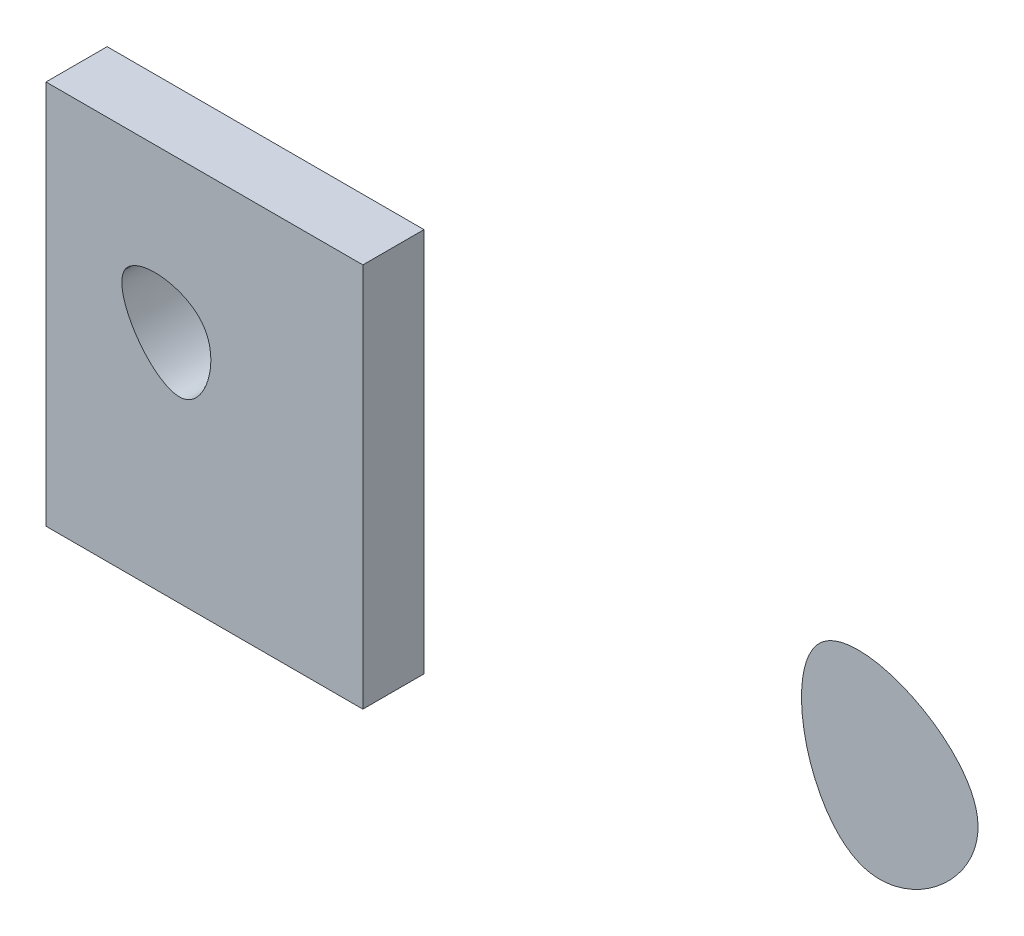
ISO-10303-21;
HEADER;
FILE_DESCRIPTION(('STEP AP214'),'2;1');
FILE_NAME('part.step','',(''),(''),'','','');
FILE_SCHEMA(('AUTOMOTIVE_DESIGN { 1 0 10303 214 1 1 1 1 }'));
ENDSEC;
DATA;
#1=APPLICATION_CONTEXT('core data for automotive mechanical design processes');
#2=APPLICATION_PROTOCOL_DEFINITION('international standard','automotive_design',2000,#1);
#3=PRODUCT_CONTEXT('',#1,'mechanical');
#4=PRODUCT('Part','Part','',(#3));
#5=PRODUCT_RELATED_PRODUCT_CATEGORY('part','',(#4));
#6=PRODUCT_DEFINITION_FORMATION('','',#4);
#7=PRODUCT_DEFINITION_CONTEXT('part definition',#1,'design');
#8=PRODUCT_DEFINITION('design','',#6,#7);
#9=PRODUCT_DEFINITION_SHAPE('','',#8);
#10=(LENGTH_UNIT() NAMED_UNIT(*) SI_UNIT(.MILLI.,.METRE.));
#11=(NAMED_UNIT(*) PLANE_ANGLE_UNIT() SI_UNIT($,.RADIAN.));
#12=(NAMED_UNIT(*) SI_UNIT($,.STERADIAN.) SOLID_ANGLE_UNIT());
#13=UNCERTAINTY_MEASURE_WITH_UNIT(LENGTH_MEASURE(1.E-05),#10,'distance_accuracy_value','');
#14=(GEOMETRIC_REPRESENTATION_CONTEXT(3) GLOBAL_UNCERTAINTY_ASSIGNED_CONTEXT((#13)) GLOBAL_UNIT_ASSIGNED_CONTEXT((#10,
#11,#12)) REPRESENTATION_CONTEXT('',''));
#15=CARTESIAN_POINT('',(0.,0.,0.));
#16=DIRECTION('',(0.,0.,1.));
#17=DIRECTION('',(1.,0.,0.));
#18=AXIS2_PLACEMENT_3D('',#15,#16,#17);
#19=CARTESIAN_POINT('',(-13.1132081205932,30.8546073425723,0.));
#20=DIRECTION('',(1.,0.,0.));
#21=DIRECTION('',(0.,1.,0.));
#22=AXIS2_PLACEMENT_3D('',#19,#20,#21);
#23=PLANE('',#22);
#24=DIRECTION('',(0.,0.,1.));
#25=VECTOR('',#24,1.);
#26=CARTESIAN_POINT('',(-13.1132081205932,-32.0887916362752,0.));
#27=LINE('',#26,#25);
#28=CARTESIAN_POINT('',(-13.1132081205932,-32.0887916362752,-10.));
#29=VERTEX_POINT('',#28);
#30=CARTESIAN_POINT('',(-13.1132081205932,-32.0887916362752,0.));
#31=VERTEX_POINT('',#30);
#32=EDGE_CURVE('E12',#29,#31,#27,.T.);
#33=ORIENTED_EDGE('',*,*,#32,.F.);
#34=DIRECTION('',(0.,1.,0.));
#35=VECTOR('',#34,1.);
#36=CARTESIAN_POINT('',(-13.1132081205932,0.,-10.));
#37=LINE('',#36,#35);
#38=CARTESIAN_POINT('',(-13.1132081205932,30.8546073425723,-10.));
#39=VERTEX_POINT('',#38);
#40=EDGE_CURVE('E98',#29,#39,#37,.T.);
#41=ORIENTED_EDGE('',*,*,#40,.T.);
#42=DIRECTION('',(0.,0.,1.));
#43=VECTOR('',#42,1.);
#44=CARTESIAN_POINT('',(-13.1132081205932,30.8546073425723,0.));
#45=LINE('',#44,#43);
#46=CARTESIAN_POINT('',(-13.1132081205932,30.8546073425723,0.));
#47=VERTEX_POINT('',#46);
#48=EDGE_CURVE('E54',#39,#47,#45,.T.);
#49=ORIENTED_EDGE('',*,*,#48,.T.);
#50=DIRECTION('',(0.,1.,0.));
#51=VECTOR('',#50,1.);
#52=CARTESIAN_POINT('',(-13.1132081205932,30.8546073425723,0.));
#53=LINE('',#52,#51);
#54=EDGE_CURVE('E115',#31,#47,#53,.T.);
#55=ORIENTED_EDGE('',*,*,#54,.F.);
#56=EDGE_LOOP('',(#33,#41,#49,#55));
#57=FACE_BOUND('',#56,.T.);
#58=ADVANCED_FACE('F44',(#57),#23,.T.);
#59=CARTESIAN_POINT('',(-64.9489484561148,30.8546073425723,0.));
#60=DIRECTION('',(0.,1.,0.));
#61=DIRECTION('',(-1.,0.,0.));
#62=AXIS2_PLACEMENT_3D('',#59,#60,#61);
#63=PLANE('',#62);
#64=ORIENTED_EDGE('',*,*,#48,.F.);
#65=DIRECTION('',(1.,0.,0.));
#66=VECTOR('',#65,1.);
#67=CARTESIAN_POINT('',(0.,30.8546073425723,-10.));
#68=LINE('',#67,#66);
#69=CARTESIAN_POINT('',(-64.9489484561148,30.8546073425723,-10.));
#70=VERTEX_POINT('',#69);
#71=EDGE_CURVE('E109',#39,#70,#68,.F.);
#72=ORIENTED_EDGE('',*,*,#71,.T.);
#73=DIRECTION('',(0.,0.,1.));
#74=VECTOR('',#73,1.);
#75=CARTESIAN_POINT('',(-64.9489484561148,30.8546073425723,0.));
#76=LINE('',#75,#74);
#77=CARTESIAN_POINT('',(-64.9489484561148,30.8546073425723,0.));
#78=VERTEX_POINT('',#77);
#79=EDGE_CURVE('E62',#70,#78,#76,.T.);
#80=ORIENTED_EDGE('',*,*,#79,.T.);
#81=DIRECTION('',(-1.,0.,0.));
#82=VECTOR('',#81,1.);
#83=CARTESIAN_POINT('',(-64.9489484561148,30.8546073425723,0.));
#84=LINE('',#83,#82);
#85=EDGE_CURVE('E92',#47,#78,#84,.T.);
#86=ORIENTED_EDGE('',*,*,#85,.F.);
#87=EDGE_LOOP('',(#64,#72,#80,#86));
#88=FACE_BOUND('',#87,.T.);
#89=ADVANCED_FACE('F120',(#88),#63,.T.);
#90=CARTESIAN_POINT('',(-64.9489484561148,30.8546073425723,0.));
#91=DIRECTION('',(-1.,0.,0.));
#92=DIRECTION('',(0.,-1.,0.));
#93=AXIS2_PLACEMENT_3D('',#90,#91,#92);
#94=PLANE('',#93);
#95=ORIENTED_EDGE('',*,*,#79,.F.);
#96=DIRECTION('',(0.,1.,0.));
#97=VECTOR('',#96,1.);
#98=CARTESIAN_POINT('',(-64.9489484561148,0.,-10.));
#99=LINE('',#98,#97);
#100=CARTESIAN_POINT('',(-64.9489484561148,-32.0887916362752,-10.));
#101=VERTEX_POINT('',#100);
#102=EDGE_CURVE('E97',#70,#101,#99,.F.);
#103=ORIENTED_EDGE('',*,*,#102,.T.);
#104=DIRECTION('',(0.,0.,1.));
#105=VECTOR('',#104,1.);
#106=CARTESIAN_POINT('',(-64.9489484561148,-32.0887916362752,0.));
#107=LINE('',#106,#105);
#108=CARTESIAN_POINT('',(-64.9489484561148,-32.0887916362752,0.));
#109=VERTEX_POINT('',#108);
#110=EDGE_CURVE('E48',#101,#109,#107,.T.);
#111=ORIENTED_EDGE('',*,*,#110,.T.);
#112=DIRECTION('',(0.,-1.,0.));
#113=VECTOR('',#112,1.);
#114=CARTESIAN_POINT('',(-64.9489484561148,30.8546073425723,0.));
#115=LINE('',#114,#113);
#116=EDGE_CURVE('E123',#78,#109,#115,.T.);
#117=ORIENTED_EDGE('',*,*,#116,.F.);
#118=EDGE_LOOP('',(#95,#103,#111,#117));
#119=FACE_BOUND('',#118,.T.);
#120=ADVANCED_FACE('F100',(#119),#94,.T.);
#121=CARTESIAN_POINT('',(-51.9900133722344,10.7991125699003,0.));
#122=CARTESIAN_POINT('',(-54.6044060913013,6.72458409520125,0.));
#123=CARTESIAN_POINT('',(-41.9614235246001,-11.5388275765151,0.));
#124=CARTESIAN_POINT('',(-34.0583393558281,12.4705141494168,0.));
#125=CARTESIAN_POINT('',(-49.9292276805776,14.0108450382745,0.));
#126=CARTESIAN_POINT('',(-51.9900133722344,10.7991125699003,0.));
#127=B_SPLINE_CURVE_WITH_KNOTS('',3,(#121,#122,#123,#124,#125,#126),.UNSPECIFIED.,.T.,.F.,(4,1,
1,4),(0.,0.396316013873514,0.687605322334089,1.),.UNSPECIFIED.);
#128=DIRECTION('',(0.,0.,1.));
#129=VECTOR('',#128,1.);
#130=SURFACE_OF_LINEAR_EXTRUSION('',#127,#129);
#131=CARTESIAN_POINT('',(-51.9900133722344,10.7991125699003,0.));
#132=VERTEX_POINT('',#131);
#133=EDGE_CURVE('E111',#132,#132,#127,.T.);
#134=ORIENTED_EDGE('',*,*,#133,.T.);
#135=EDGE_LOOP('',(#134));
#136=FACE_BOUND('',#135,.T.);
#137=CARTESIAN_POINT('',(-51.9900133722344,10.7991125699003,-10.));
#138=CARTESIAN_POINT('',(-54.6044060913013,6.72458409520125,-10.));
#139=CARTESIAN_POINT('',(-41.9614235246001,-11.5388275765151,-10.));
#140=CARTESIAN_POINT('',(-34.0583393558281,12.4705141494168,-10.));
#141=CARTESIAN_POINT('',(-49.9292276805776,14.0108450382745,-10.));
#142=CARTESIAN_POINT('',(-51.9900133722344,10.7991125699003,-10.));
#143=B_SPLINE_CURVE_WITH_KNOTS('',3,(#137,#138,#139,#140,#141,#142),.UNSPECIFIED.,.T.,.F.,(4,1,
1,4),(0.,0.396316013873514,0.687605322334089,1.),.UNSPECIFIED.);
#144=CARTESIAN_POINT('',(-51.9900133722344,10.7991125699003,-10.));
#145=VERTEX_POINT('',#144);
#146=EDGE_CURVE('E101',#145,#145,#143,.T.);
#147=ORIENTED_EDGE('',*,*,#146,.F.);
#148=EDGE_LOOP('',(#147));
#149=FACE_BOUND('',#148,.T.);
#150=ADVANCED_FACE('F133',(#136,#149),#130,.F.);
#151=CARTESIAN_POINT('',(-64.9489484561148,-32.0887916362752,0.));
#152=DIRECTION('',(0.,-1.,0.));
#153=DIRECTION('',(1.,0.,0.));
#154=AXIS2_PLACEMENT_3D('',#151,#152,#153);
#155=PLANE('',#154);
#156=DIRECTION('',(1.,0.,0.));
#157=VECTOR('',#156,1.);
#158=CARTESIAN_POINT('',(0.,-32.0887916362752,-10.));
#159=LINE('',#158,#157);
#160=EDGE_CURVE('E86',#101,#29,#159,.T.);
#161=ORIENTED_EDGE('',*,*,#160,.T.);
#162=ORIENTED_EDGE('',*,*,#32,.T.);
#163=DIRECTION('',(1.,0.,0.));
#164=VECTOR('',#163,1.);
#165=CARTESIAN_POINT('',(-64.9489484561148,-32.0887916362752,0.));
#166=LINE('',#165,#164);
#167=EDGE_CURVE('E88',#109,#31,#166,.T.);
#168=ORIENTED_EDGE('',*,*,#167,.F.);
#169=ORIENTED_EDGE('',*,*,#110,.F.);
#170=EDGE_LOOP('',(#161,#162,#168,#169));
#171=FACE_BOUND('',#170,.T.);
#172=ADVANCED_FACE('F46',(#171),#155,.T.);
#173=CARTESIAN_POINT('',(0.,0.,0.));
#174=DIRECTION('',(0.,0.,1.));
#175=DIRECTION('',(1.,0.,0.));
#176=AXIS2_PLACEMENT_3D('',#173,#174,#175);
#177=PLANE('',#176);
#178=ORIENTED_EDGE('',*,*,#133,.F.);
#179=EDGE_LOOP('',(#178));
#180=FACE_BOUND('',#179,.T.);
#181=ORIENTED_EDGE('',*,*,#116,.T.);
#182=ORIENTED_EDGE('',*,*,#167,.T.);
#183=ORIENTED_EDGE('',*,*,#54,.T.);
#184=ORIENTED_EDGE('',*,*,#85,.T.);
#185=EDGE_LOOP('',(#181,#182,#183,#184));
#186=FACE_BOUND('',#185,.T.);
#187=ADVANCED_FACE('F118',(#180,#186),#177,.T.);
#188=CARTESIAN_POINT('',(0.,0.,-10.));
#189=DIRECTION('',(0.,0.,1.));
#190=DIRECTION('',(1.,0.,0.));
#191=AXIS2_PLACEMENT_3D('',#188,#189,#190);
#192=PLANE('',#191);
#193=ORIENTED_EDGE('',*,*,#146,.T.);
#194=EDGE_LOOP('',(#193));
#195=FACE_BOUND('',#194,.T.);
#196=ORIENTED_EDGE('',*,*,#102,.F.);
#197=ORIENTED_EDGE('',*,*,#71,.F.);
#198=ORIENTED_EDGE('',*,*,#40,.F.);
#199=ORIENTED_EDGE('',*,*,#160,.F.);
#200=EDGE_LOOP('',(#196,#197,#198,#199));
#201=FACE_BOUND('',#200,.T.);
#202=ADVANCED_FACE('F95',(#195,#201),#192,.F.);
#203=CLOSED_SHELL('',(#58,#89,#120,#150,#172,#187,#202));
#204=MANIFOLD_SOLID_BREP('B2',#203);
#205=CARTESIAN_POINT('',(80.9539535847802,-10.0843216007174,0.));
#206=DIRECTION('',(0.,0.,1.));
#207=DIRECTION('',(1.,0.,0.));
#208=AXIS2_PLACEMENT_3D('',#205,#206,#207);
#209=PLANE('',#208);
#210=CARTESIAN_POINT('',(62.1720337952832,15.1187575978605,0.));
#211=CARTESIAN_POINT('',(55.0376372120154,9.51503155915517,0.));
#212=CARTESIAN_POINT('',(63.0782619063658,-27.6851904935883,0.));
#213=CARTESIAN_POINT('',(101.581645088255,5.25535913157544,0.));
#214=CARTESIAN_POINT('',(69.0161815556011,20.4945071191567,0.));
#215=CARTESIAN_POINT('',(62.1720337952832,15.1187575978605,0.));
#216=B_SPLINE_CURVE_WITH_KNOTS('',3,(#210,#211,#212,#213,#214,#215),.UNSPECIFIED.,.T.,.F.,(4,1,
1,4),(0.,0.358406711506224,0.656174357115058,1.),.UNSPECIFIED.);
#217=CARTESIAN_POINT('',(62.1720337952832,15.1187575978605,0.));
#218=VERTEX_POINT('',#217);
#219=EDGE_CURVE('E43',#218,#218,#216,.T.);
#220=ORIENTED_EDGE('',*,*,#219,.T.);
#221=EDGE_LOOP('',(#220));
#222=FACE_BOUND('',#221,.T.);
#223=ADVANCED_FACE('F199',(#222),#209,.T.);
#224=OPEN_SHELL('',(#223));
#225=SHELL_BASED_SURFACE_MODEL('B6',(#224));
#226=ADVANCED_BREP_SHAPE_REPRESENTATION('',(#18,#204),#14);
#227=MANIFOLD_SURFACE_SHAPE_REPRESENTATION('',(#18,#225),#14);
#228=SHAPE_REPRESENTATION('',(#18),#14);
#229=SHAPE_DEFINITION_REPRESENTATION(#9,#228);
#230=SHAPE_REPRESENTATION_RELATIONSHIP('','',#228,#226);
#231=SHAPE_REPRESENTATION_RELATIONSHIP('','',#228,#227);
ENDSEC;
END-ISO-10303-21;
